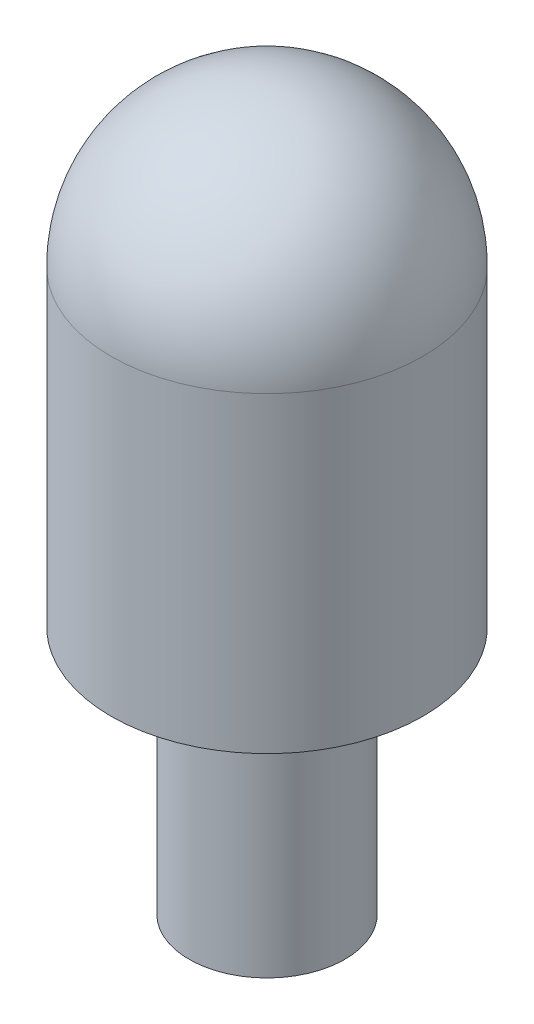
ISO-10303-21;
HEADER;
FILE_DESCRIPTION(('STEP AP214'),'2;1');
FILE_NAME('part.step','',(''),(''),'','','');
FILE_SCHEMA(('AUTOMOTIVE_DESIGN { 1 0 10303 214 1 1 1 1 }'));
ENDSEC;
DATA;
#1=APPLICATION_CONTEXT('core data for automotive mechanical design processes');
#2=APPLICATION_PROTOCOL_DEFINITION('international standard','automotive_design',2000,#1);
#3=PRODUCT_CONTEXT('',#1,'mechanical');
#4=PRODUCT('Part','Part','',(#3));
#5=PRODUCT_RELATED_PRODUCT_CATEGORY('part','',(#4));
#6=PRODUCT_DEFINITION_FORMATION('','',#4);
#7=PRODUCT_DEFINITION_CONTEXT('part definition',#1,'design');
#8=PRODUCT_DEFINITION('design','',#6,#7);
#9=PRODUCT_DEFINITION_SHAPE('','',#8);
#10=(LENGTH_UNIT() NAMED_UNIT(*) SI_UNIT(.MILLI.,.METRE.));
#11=(NAMED_UNIT(*) PLANE_ANGLE_UNIT() SI_UNIT($,.RADIAN.));
#12=(NAMED_UNIT(*) SI_UNIT($,.STERADIAN.) SOLID_ANGLE_UNIT());
#13=UNCERTAINTY_MEASURE_WITH_UNIT(LENGTH_MEASURE(1.E-05),#10,'distance_accuracy_value','');
#14=(GEOMETRIC_REPRESENTATION_CONTEXT(3) GLOBAL_UNCERTAINTY_ASSIGNED_CONTEXT((#13)) GLOBAL_UNIT_ASSIGNED_CONTEXT((#10,
#11,#12)) REPRESENTATION_CONTEXT('',''));
#15=CARTESIAN_POINT('',(0.,0.,0.));
#16=DIRECTION('',(0.,0.,1.));
#17=DIRECTION('',(1.,0.,0.));
#18=AXIS2_PLACEMENT_3D('',#15,#16,#17);
#19=CARTESIAN_POINT('',(0.,0.,-2.5));
#20=DIRECTION('',(0.,-1.,0.));
#21=DIRECTION('',(0.,0.,-1.));
#22=AXIS2_PLACEMENT_3D('',#19,#20,#21);
#23=PLANE('',#22);
#24=CARTESIAN_POINT('',(0.,0.,0.));
#25=DIRECTION('',(0.,-1.,0.));
#26=DIRECTION('',(0.,0.,-1.));
#27=AXIS2_PLACEMENT_3D('',#24,#25,#26);
#28=CIRCLE('',#27,2.5);
#29=CARTESIAN_POINT('',(0.,0.,-2.5));
#30=VERTEX_POINT('',#29);
#31=EDGE_CURVE('E10',#30,#30,#28,.T.);
#32=ORIENTED_EDGE('',*,*,#31,.T.);
#33=EDGE_LOOP('',(#32));
#34=FACE_BOUND('',#33,.T.);
#35=ADVANCED_FACE('F35',(#34),#23,.T.);
#36=CARTESIAN_POINT('',(0.,0.,0.));
#37=DIRECTION('',(0.,-1.,0.));
#38=DIRECTION('',(0.,0.,-1.));
#39=AXIS2_PLACEMENT_3D('',#36,#37,#38);
#40=CYLINDRICAL_SURFACE('',#39,2.5);
#41=CARTESIAN_POINT('',(0.,8.,0.));
#42=DIRECTION('',(0.,-1.,0.));
#43=DIRECTION('',(0.,0.,-1.));
#44=AXIS2_PLACEMENT_3D('',#41,#42,#43);
#45=CIRCLE('',#44,2.5);
#46=CARTESIAN_POINT('',(0.,8.,-2.5));
#47=VERTEX_POINT('',#46);
#48=EDGE_CURVE('E42',#47,#47,#45,.T.);
#49=ORIENTED_EDGE('',*,*,#48,.T.);
#50=EDGE_LOOP('',(#49));
#51=FACE_BOUND('',#50,.T.);
#52=ORIENTED_EDGE('',*,*,#31,.F.);
#53=EDGE_LOOP('',(#52));
#54=FACE_BOUND('',#53,.T.);
#55=ADVANCED_FACE('F71',(#51,#54),#40,.T.);
#56=CARTESIAN_POINT('',(0.,8.,-5.));
#57=DIRECTION('',(0.,-1.,0.));
#58=DIRECTION('',(0.,0.,-1.));
#59=AXIS2_PLACEMENT_3D('',#56,#57,#58);
#60=PLANE('',#59);
#61=CARTESIAN_POINT('',(0.,8.,0.));
#62=DIRECTION('',(0.,-1.,0.));
#63=DIRECTION('',(0.,0.,-1.));
#64=AXIS2_PLACEMENT_3D('',#61,#62,#63);
#65=CIRCLE('',#64,5.);
#66=CARTESIAN_POINT('',(0.,8.,-5.));
#67=VERTEX_POINT('',#66);
#68=EDGE_CURVE('E48',#67,#67,#65,.T.);
#69=ORIENTED_EDGE('',*,*,#68,.T.);
#70=EDGE_LOOP('',(#69));
#71=FACE_BOUND('',#70,.T.);
#72=ORIENTED_EDGE('',*,*,#48,.F.);
#73=EDGE_LOOP('',(#72));
#74=FACE_BOUND('',#73,.T.);
#75=ADVANCED_FACE('F68',(#71,#74),#60,.T.);
#76=CARTESIAN_POINT('',(0.,0.,0.));
#77=DIRECTION('',(0.,-1.,0.));
#78=DIRECTION('',(0.,0.,-1.));
#79=AXIS2_PLACEMENT_3D('',#76,#77,#78);
#80=CYLINDRICAL_SURFACE('',#79,5.);
#81=CARTESIAN_POINT('',(0.,18.,0.));
#82=DIRECTION('',(0.,-1.,0.));
#83=DIRECTION('',(0.,0.,-1.));
#84=AXIS2_PLACEMENT_3D('',#81,#82,#83);
#85=CIRCLE('',#84,5.);
#86=CARTESIAN_POINT('',(0.,18.,-5.));
#87=VERTEX_POINT('',#86);
#88=EDGE_CURVE('E53',#87,#87,#85,.T.);
#89=ORIENTED_EDGE('',*,*,#88,.T.);
#90=EDGE_LOOP('',(#89));
#91=FACE_BOUND('',#90,.T.);
#92=ORIENTED_EDGE('',*,*,#68,.F.);
#93=EDGE_LOOP('',(#92));
#94=FACE_BOUND('',#93,.T.);
#95=ADVANCED_FACE('F59',(#91,#94),#80,.T.);
#96=CARTESIAN_POINT('',(0.,18.,0.));
#97=DIRECTION('',(0.,-1.,0.));
#98=DIRECTION('',(0.,0.,-1.));
#99=AXIS2_PLACEMENT_3D('',#96,#97,#98);
#100=SPHERICAL_SURFACE('',#99,5.);
#101=ORIENTED_EDGE('',*,*,#88,.F.);
#102=EDGE_LOOP('',(#101));
#103=FACE_BOUND('',#102,.T.);
#104=ADVANCED_FACE('F62',(#103),#100,.T.);
#105=CLOSED_SHELL('',(#35,#55,#75,#95,#104));
#106=MANIFOLD_SOLID_BREP('B2',#105);
#107=ADVANCED_BREP_SHAPE_REPRESENTATION('',(#18,#106),#14);
#108=SHAPE_DEFINITION_REPRESENTATION(#9,#107);
ENDSEC;
END-ISO-10303-21;
